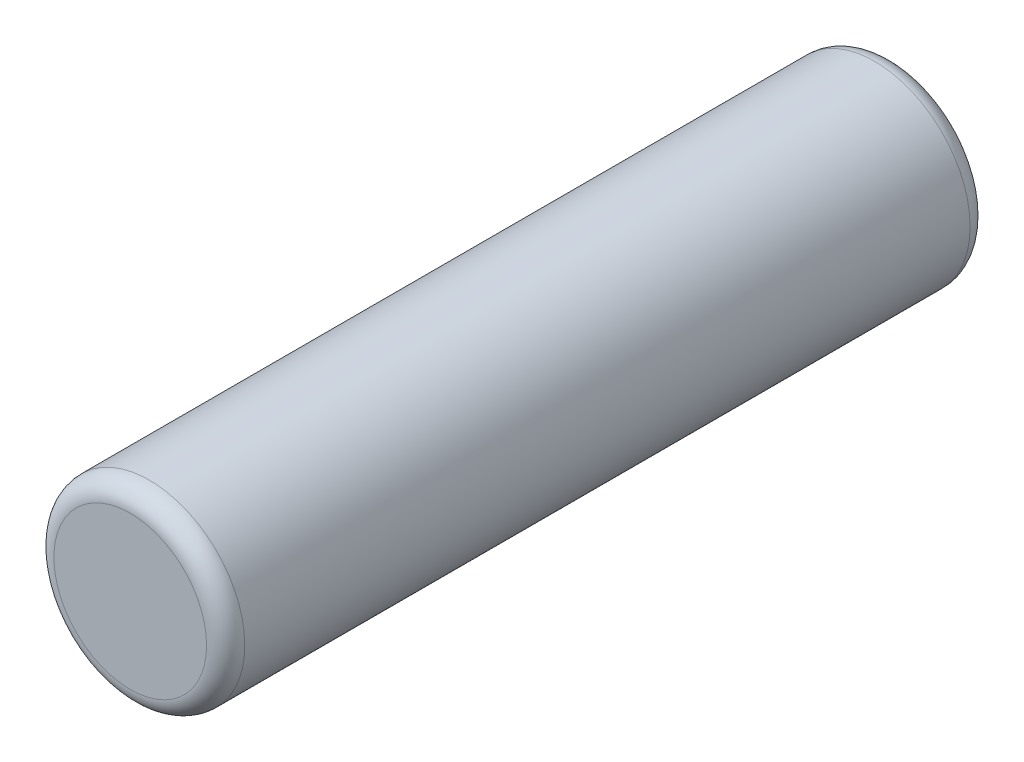
ISO-10303-21;
HEADER;
FILE_DESCRIPTION(('STEP AP214'),'2;1');
FILE_NAME('part.step','',(''),(''),'','','');
FILE_SCHEMA(('AUTOMOTIVE_DESIGN { 1 0 10303 214 1 1 1 1 }'));
ENDSEC;
DATA;
#1=APPLICATION_CONTEXT('core data for automotive mechanical design processes');
#2=APPLICATION_PROTOCOL_DEFINITION('international standard','automotive_design',2000,#1);
#3=PRODUCT_CONTEXT('',#1,'mechanical');
#4=PRODUCT('Part','Part','',(#3));
#5=PRODUCT_RELATED_PRODUCT_CATEGORY('part','',(#4));
#6=PRODUCT_DEFINITION_FORMATION('','',#4);
#7=PRODUCT_DEFINITION_CONTEXT('part definition',#1,'design');
#8=PRODUCT_DEFINITION('design','',#6,#7);
#9=PRODUCT_DEFINITION_SHAPE('','',#8);
#10=(LENGTH_UNIT() NAMED_UNIT(*) SI_UNIT(.MILLI.,.METRE.));
#11=(NAMED_UNIT(*) PLANE_ANGLE_UNIT() SI_UNIT($,.RADIAN.));
#12=(NAMED_UNIT(*) SI_UNIT($,.STERADIAN.) SOLID_ANGLE_UNIT());
#13=UNCERTAINTY_MEASURE_WITH_UNIT(LENGTH_MEASURE(1.E-05),#10,'distance_accuracy_value','');
#14=(GEOMETRIC_REPRESENTATION_CONTEXT(3) GLOBAL_UNCERTAINTY_ASSIGNED_CONTEXT((#13)) GLOBAL_UNIT_ASSIGNED_CONTEXT((#10,
#11,#12)) REPRESENTATION_CONTEXT('',''));
#15=CARTESIAN_POINT('',(0.,0.,0.));
#16=DIRECTION('',(0.,0.,1.));
#17=DIRECTION('',(1.,0.,0.));
#18=AXIS2_PLACEMENT_3D('',#15,#16,#17);
#19=CARTESIAN_POINT('',(0.,0.,20.));
#20=DIRECTION('',(0.,0.,-1.));
#21=DIRECTION('',(-1.,0.,0.));
#22=AXIS2_PLACEMENT_3D('',#19,#20,#21);
#23=CYLINDRICAL_SURFACE('',#22,2.5);
#24=CARTESIAN_POINT('',(0.,0.,0.5));
#25=DIRECTION('',(0.,0.,1.));
#26=DIRECTION('',(1.,0.,0.));
#27=AXIS2_PLACEMENT_3D('',#24,#25,#26);
#28=CIRCLE('',#27,2.5);
#29=CARTESIAN_POINT('',(2.5,0.,0.5));
#30=VERTEX_POINT('',#29);
#31=EDGE_CURVE('E42',#30,#30,#28,.T.);
#32=ORIENTED_EDGE('',*,*,#31,.T.);
#33=EDGE_LOOP('',(#32));
#34=FACE_BOUND('',#33,.T.);
#35=CARTESIAN_POINT('',(0.,0.,19.5));
#36=DIRECTION('',(0.,0.,1.));
#37=DIRECTION('',(1.,0.,0.));
#38=AXIS2_PLACEMENT_3D('',#35,#36,#37);
#39=CIRCLE('',#38,2.5);
#40=CARTESIAN_POINT('',(2.5,0.,19.5));
#41=VERTEX_POINT('',#40);
#42=EDGE_CURVE('E46',#41,#41,#39,.F.);
#43=ORIENTED_EDGE('',*,*,#42,.T.);
#44=EDGE_LOOP('',(#43));
#45=FACE_BOUND('',#44,.T.);
#46=ADVANCED_FACE('F31',(#34,#45),#23,.T.);
#47=CARTESIAN_POINT('',(0.,0.,20.));
#48=DIRECTION('',(0.,0.,1.));
#49=DIRECTION('',(1.,0.,0.));
#50=AXIS2_PLACEMENT_3D('',#47,#48,#49);
#51=PLANE('',#50);
#52=CARTESIAN_POINT('',(0.,0.,20.));
#53=DIRECTION('',(0.,0.,1.));
#54=DIRECTION('',(1.,0.,0.));
#55=AXIS2_PLACEMENT_3D('',#52,#53,#54);
#56=CIRCLE('',#55,2.);
#57=CARTESIAN_POINT('',(2.,0.,20.));
#58=VERTEX_POINT('',#57);
#59=EDGE_CURVE('E10',#58,#58,#56,.T.);
#60=ORIENTED_EDGE('',*,*,#59,.T.);
#61=EDGE_LOOP('',(#60));
#62=FACE_BOUND('',#61,.T.);
#63=ADVANCED_FACE('F62',(#62),#51,.T.);
#64=CARTESIAN_POINT('',(0.,0.,0.));
#65=DIRECTION('',(0.,0.,1.));
#66=DIRECTION('',(1.,0.,0.));
#67=AXIS2_PLACEMENT_3D('',#64,#65,#66);
#68=PLANE('',#67);
#69=CARTESIAN_POINT('',(0.,0.,0.));
#70=DIRECTION('',(0.,0.,1.));
#71=DIRECTION('',(1.,0.,0.));
#72=AXIS2_PLACEMENT_3D('',#69,#70,#71);
#73=CIRCLE('',#72,2.);
#74=CARTESIAN_POINT('',(2.,0.,0.));
#75=VERTEX_POINT('',#74);
#76=EDGE_CURVE('E38',#75,#75,#73,.F.);
#77=ORIENTED_EDGE('',*,*,#76,.T.);
#78=EDGE_LOOP('',(#77));
#79=FACE_BOUND('',#78,.T.);
#80=ADVANCED_FACE('F59',(#79),#68,.F.);
#81=CARTESIAN_POINT('',(0.,0.,0.5));
#82=DIRECTION('',(0.,0.,1.));
#83=DIRECTION('',(1.,0.,0.));
#84=AXIS2_PLACEMENT_3D('',#81,#82,#83);
#85=TOROIDAL_SURFACE('',#84,2.,0.5);
#86=ORIENTED_EDGE('',*,*,#76,.F.);
#87=EDGE_LOOP('',(#86));
#88=FACE_BOUND('',#87,.T.);
#89=ORIENTED_EDGE('',*,*,#31,.F.);
#90=EDGE_LOOP('',(#89));
#91=FACE_BOUND('',#90,.T.);
#92=ADVANCED_FACE('F55',(#88,#91),#85,.T.);
#93=CARTESIAN_POINT('',(0.,0.,19.5));
#94=DIRECTION('',(0.,0.,1.));
#95=DIRECTION('',(1.,0.,0.));
#96=AXIS2_PLACEMENT_3D('',#93,#94,#95);
#97=TOROIDAL_SURFACE('',#96,2.,0.5);
#98=ORIENTED_EDGE('',*,*,#42,.F.);
#99=EDGE_LOOP('',(#98));
#100=FACE_BOUND('',#99,.T.);
#101=ORIENTED_EDGE('',*,*,#59,.F.);
#102=EDGE_LOOP('',(#101));
#103=FACE_BOUND('',#102,.T.);
#104=ADVANCED_FACE('F33',(#100,#103),#97,.T.);
#105=CLOSED_SHELL('',(#46,#63,#80,#92,#104));
#106=MANIFOLD_SOLID_BREP('B2',#105);
#107=ADVANCED_BREP_SHAPE_REPRESENTATION('',(#18,#106),#14);
#108=SHAPE_DEFINITION_REPRESENTATION(#9,#107);
ENDSEC;
END-ISO-10303-21;
